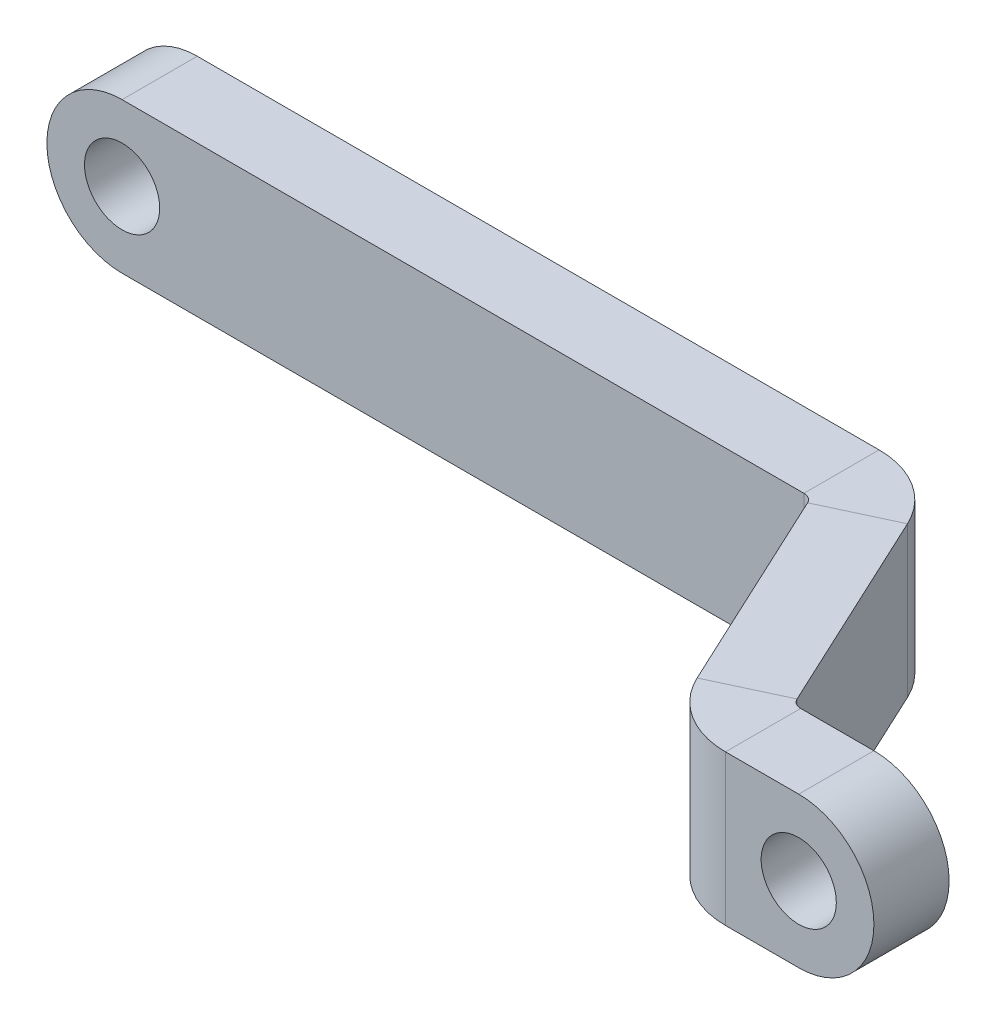
ISO-10303-21;
HEADER;
FILE_DESCRIPTION(('STEP AP214'),'2;1');
FILE_NAME('part.step','',(''),(''),'','','');
FILE_SCHEMA(('AUTOMOTIVE_DESIGN { 1 0 10303 214 1 1 1 1 }'));
ENDSEC;
DATA;
#1=APPLICATION_CONTEXT('core data for automotive mechanical design processes');
#2=APPLICATION_PROTOCOL_DEFINITION('international standard','automotive_design',2000,#1);
#3=PRODUCT_CONTEXT('',#1,'mechanical');
#4=PRODUCT('Part','Part','',(#3));
#5=PRODUCT_RELATED_PRODUCT_CATEGORY('part','',(#4));
#6=PRODUCT_DEFINITION_FORMATION('','',#4);
#7=PRODUCT_DEFINITION_CONTEXT('part definition',#1,'design');
#8=PRODUCT_DEFINITION('design','',#6,#7);
#9=PRODUCT_DEFINITION_SHAPE('','',#8);
#10=(LENGTH_UNIT() NAMED_UNIT(*) SI_UNIT(.MILLI.,.METRE.));
#11=(NAMED_UNIT(*) PLANE_ANGLE_UNIT() SI_UNIT($,.RADIAN.));
#12=(NAMED_UNIT(*) SI_UNIT($,.STERADIAN.) SOLID_ANGLE_UNIT());
#13=UNCERTAINTY_MEASURE_WITH_UNIT(LENGTH_MEASURE(1.E-05),#10,'distance_accuracy_value','');
#14=(GEOMETRIC_REPRESENTATION_CONTEXT(3) GLOBAL_UNCERTAINTY_ASSIGNED_CONTEXT((#13)) GLOBAL_UNIT_ASSIGNED_CONTEXT((#10,
#11,#12)) REPRESENTATION_CONTEXT('',''));
#15=CARTESIAN_POINT('',(0.,0.,0.));
#16=DIRECTION('',(0.,0.,1.));
#17=DIRECTION('',(1.,0.,0.));
#18=AXIS2_PLACEMENT_3D('',#15,#16,#17);
#19=CARTESIAN_POINT('',(29.8289487955123,5.,-46.1124519814672));
#20=DIRECTION('',(0.,1.,0.));
#21=DIRECTION('',(-0.906307787036651,0.,0.422618261740697));
#22=AXIS2_PLACEMENT_3D('',#19,#20,#21);
#23=PLANE('',#22);
#24=DIRECTION('',(-0.422618261740697,0.,-0.906307787036651));
#25=VECTOR('',#24,1.);
#26=CARTESIAN_POINT('',(25.2974098603291,5.,-43.9993606727638));
#27=LINE('',#26,#25);
#28=CARTESIAN_POINT('',(52.4305247207088,5.,14.1877919203017));
#29=VERTEX_POINT('',#28);
#30=CARTESIAN_POINT('',(46.012969057783,5.,0.425299388401803));
#31=VERTEX_POINT('',#30);
#32=EDGE_CURVE('E248',#29,#31,#27,.T.);
#33=ORIENTED_EDGE('',*,*,#32,.F.);
#34=DIRECTION('',(0.906307787036651,0.,-0.422618261740697));
#35=VECTOR('',#34,1.);
#36=CARTESIAN_POINT('',(56.9620636558921,5.,12.0747006115982));
#37=LINE('',#36,#35);
#38=CARTESIAN_POINT('',(56.9620636558921,5.,12.0747006115982));
#39=VERTEX_POINT('',#38);
#40=EDGE_CURVE('E240',#29,#39,#37,.T.);
#41=ORIENTED_EDGE('',*,*,#40,.T.);
#42=DIRECTION('',(-0.422618261740697,0.,-0.906307787036651));
#43=VECTOR('',#42,1.);
#44=CARTESIAN_POINT('',(29.8289487955123,5.,-46.1124519814672));
#45=LINE('',#44,#43);
#46=CARTESIAN_POINT('',(50.5445079929662,5.,-1.68779192030168));
#47=VERTEX_POINT('',#46);
#48=EDGE_CURVE('E47',#39,#47,#45,.T.);
#49=ORIENTED_EDGE('',*,*,#48,.T.);
#50=DIRECTION('',(0.906307787036651,0.,-0.422618261740697));
#51=VECTOR('',#50,1.);
#52=CARTESIAN_POINT('',(50.5445079929662,5.,-1.68779192030168));
#53=LINE('',#52,#51);
#54=EDGE_CURVE('E236',#31,#47,#53,.T.);
#55=ORIENTED_EDGE('',*,*,#54,.F.);
#56=EDGE_LOOP('',(#33,#41,#49,#55));
#57=FACE_BOUND('',#56,.T.);
#58=ADVANCED_FACE('F43',(#57),#23,.T.);
#59=CARTESIAN_POINT('',(29.8289487955123,-5.,-46.1124519814672));
#60=DIRECTION('',(0.,-1.,0.));
#61=DIRECTION('',(0.906307787036651,0.,-0.422618261740697));
#62=AXIS2_PLACEMENT_3D('',#59,#60,#61);
#63=PLANE('',#62);
#64=DIRECTION('',(0.422618261740697,0.,0.906307787036651));
#65=VECTOR('',#64,1.);
#66=CARTESIAN_POINT('',(29.8289487955123,-5.,-46.1124519814672));
#67=LINE('',#66,#65);
#68=CARTESIAN_POINT('',(50.5445079929662,-4.99999999999999,-1.68779192030168));
#69=VERTEX_POINT('',#68);
#70=CARTESIAN_POINT('',(56.9620636558921,-5.,12.0747006115982));
#71=VERTEX_POINT('',#70);
#72=EDGE_CURVE('E245',#69,#71,#67,.T.);
#73=ORIENTED_EDGE('',*,*,#72,.T.);
#74=DIRECTION('',(-0.906307787036651,0.,0.422618261740697));
#75=VECTOR('',#74,1.);
#76=CARTESIAN_POINT('',(56.9620636558921,-5.,12.0747006115982));
#77=LINE('',#76,#75);
#78=CARTESIAN_POINT('',(52.4305247207088,-5.,14.1877919203017));
#79=VERTEX_POINT('',#78);
#80=EDGE_CURVE('E12',#71,#79,#77,.T.);
#81=ORIENTED_EDGE('',*,*,#80,.T.);
#82=DIRECTION('',(0.422618261740697,0.,0.906307787036651));
#83=VECTOR('',#82,1.);
#84=CARTESIAN_POINT('',(25.2974098603291,-5.,-43.9993606727638));
#85=LINE('',#84,#83);
#86=CARTESIAN_POINT('',(46.012969057783,-4.99999999999998,0.425299388401803));
#87=VERTEX_POINT('',#86);
#88=EDGE_CURVE('E194',#87,#79,#85,.T.);
#89=ORIENTED_EDGE('',*,*,#88,.F.);
#90=DIRECTION('',(-0.906307787036651,0.,0.422618261740697));
#91=VECTOR('',#90,1.);
#92=CARTESIAN_POINT('',(50.5445079929662,-5.,-1.68779192030168));
#93=LINE('',#92,#91);
#94=EDGE_CURVE('E232',#69,#87,#93,.T.);
#95=ORIENTED_EDGE('',*,*,#94,.F.);
#96=EDGE_LOOP('',(#73,#81,#89,#95));
#97=FACE_BOUND('',#96,.T.);
#98=ADVANCED_FACE('F45',(#97),#63,.T.);
#99=CARTESIAN_POINT('',(25.2974098603291,0.,-43.9993606727638));
#100=DIRECTION('',(-0.906307787036651,0.,0.422618261740697));
#101=DIRECTION('',(0.422618261740697,0.,0.906307787036651));
#102=AXIS2_PLACEMENT_3D('',#99,#100,#101);
#103=PLANE('',#102);
#104=ORIENTED_EDGE('',*,*,#88,.T.);
#105=DIRECTION('',(0.,1.,0.));
#106=VECTOR('',#105,1.);
#107=CARTESIAN_POINT('',(52.4305247207088,0.,14.1877919203017));
#108=LINE('',#107,#106);
#109=EDGE_CURVE('E52',#79,#29,#108,.T.);
#110=ORIENTED_EDGE('',*,*,#109,.T.);
#111=ORIENTED_EDGE('',*,*,#32,.T.);
#112=DIRECTION('',(0.,1.,0.));
#113=VECTOR('',#112,1.);
#114=CARTESIAN_POINT('',(46.012969057783,0.,0.425299388401801));
#115=LINE('',#114,#113);
#116=EDGE_CURVE('E234',#87,#31,#115,.T.);
#117=ORIENTED_EDGE('',*,*,#116,.F.);
#118=EDGE_LOOP('',(#104,#110,#111,#117));
#119=FACE_BOUND('',#118,.T.);
#120=ADVANCED_FACE('F254',(#119),#103,.T.);
#121=CARTESIAN_POINT('',(29.8289487955123,0.,-46.1124519814672));
#122=DIRECTION('',(-0.906307787036651,0.,0.422618261740697));
#123=DIRECTION('',(0.422618261740697,0.,0.906307787036651));
#124=AXIS2_PLACEMENT_3D('',#121,#122,#123);
#125=PLANE('',#124);
#126=DIRECTION('',(0.,1.,0.));
#127=VECTOR('',#126,1.);
#128=CARTESIAN_POINT('',(56.9620636558921,0.,12.0747006115982));
#129=LINE('',#128,#127);
#130=EDGE_CURVE('E238',#71,#39,#129,.T.);
#131=ORIENTED_EDGE('',*,*,#130,.F.);
#132=ORIENTED_EDGE('',*,*,#72,.F.);
#133=DIRECTION('',(0.,1.,0.));
#134=VECTOR('',#133,1.);
#135=CARTESIAN_POINT('',(50.5445079929662,0.,-1.68779192030168));
#136=LINE('',#135,#134);
#137=EDGE_CURVE('E229',#69,#47,#136,.T.);
#138=ORIENTED_EDGE('',*,*,#137,.T.);
#139=ORIENTED_EDGE('',*,*,#48,.F.);
#140=EDGE_LOOP('',(#131,#132,#138,#139));
#141=FACE_BOUND('',#140,.T.);
#142=ADVANCED_FACE('F267',(#141),#125,.F.);
#143=CARTESIAN_POINT('',(0.,0.,-5.));
#144=DIRECTION('',(0.,0.,1.));
#145=DIRECTION('',(1.,0.,0.));
#146=AXIS2_PLACEMENT_3D('',#143,#144,#145);
#147=CYLINDRICAL_SURFACE('',#146,2.5);
#148=CARTESIAN_POINT('',(0.,0.,-5.));
#149=DIRECTION('',(0.,0.,1.));
#150=DIRECTION('',(1.,0.,0.));
#151=AXIS2_PLACEMENT_3D('',#148,#149,#150);
#152=CIRCLE('',#151,2.5);
#153=CARTESIAN_POINT('',(2.5,0.,-5.));
#154=VERTEX_POINT('',#153);
#155=EDGE_CURVE('E217',#154,#154,#152,.T.);
#156=ORIENTED_EDGE('',*,*,#155,.F.);
#157=EDGE_LOOP('',(#156));
#158=FACE_BOUND('',#157,.T.);
#159=CARTESIAN_POINT('',(0.,0.,0.));
#160=DIRECTION('',(0.,0.,1.));
#161=DIRECTION('',(1.,0.,0.));
#162=AXIS2_PLACEMENT_3D('',#159,#160,#161);
#163=CIRCLE('',#162,2.5);
#164=CARTESIAN_POINT('',(2.5,0.,0.));
#165=VERTEX_POINT('',#164);
#166=EDGE_CURVE('E225',#165,#165,#163,.T.);
#167=ORIENTED_EDGE('',*,*,#166,.T.);
#168=EDGE_LOOP('',(#167));
#169=FACE_BOUND('',#168,.T.);
#170=ADVANCED_FACE('F316',(#158,#169),#147,.F.);
#171=CARTESIAN_POINT('',(0.,0.,-5.));
#172=DIRECTION('',(0.,0.,1.));
#173=DIRECTION('',(1.,0.,0.));
#174=AXIS2_PLACEMENT_3D('',#171,#172,#173);
#175=CYLINDRICAL_SURFACE('',#174,5.);
#176=CARTESIAN_POINT('',(0.,0.,0.));
#177=DIRECTION('',(0.,0.,1.));
#178=DIRECTION('',(1.,0.,0.));
#179=AXIS2_PLACEMENT_3D('',#176,#177,#178);
#180=CIRCLE('',#179,5.);
#181=CARTESIAN_POINT('',(0.,5.,0.));
#182=VERTEX_POINT('',#181);
#183=CARTESIAN_POINT('',(0.,-5.,0.));
#184=VERTEX_POINT('',#183);
#185=EDGE_CURVE('E200',#182,#184,#180,.T.);
#186=ORIENTED_EDGE('',*,*,#185,.F.);
#187=DIRECTION('',(0.,0.,1.));
#188=VECTOR('',#187,1.);
#189=CARTESIAN_POINT('',(0.,5.,-5.));
#190=LINE('',#189,#188);
#191=CARTESIAN_POINT('',(0.,5.,-5.));
#192=VERTEX_POINT('',#191);
#193=EDGE_CURVE('E191',#192,#182,#190,.T.);
#194=ORIENTED_EDGE('',*,*,#193,.F.);
#195=CARTESIAN_POINT('',(0.,0.,-5.));
#196=DIRECTION('',(0.,0.,1.));
#197=DIRECTION('',(1.,0.,0.));
#198=AXIS2_PLACEMENT_3D('',#195,#196,#197);
#199=CIRCLE('',#198,5.);
#200=CARTESIAN_POINT('',(0.,-5.,-5.));
#201=VERTEX_POINT('',#200);
#202=EDGE_CURVE('E222',#192,#201,#199,.T.);
#203=ORIENTED_EDGE('',*,*,#202,.T.);
#204=DIRECTION('',(0.,0.,1.));
#205=VECTOR('',#204,1.);
#206=CARTESIAN_POINT('',(0.,-5.,-5.));
#207=LINE('',#206,#205);
#208=EDGE_CURVE('E220',#201,#184,#207,.T.);
#209=ORIENTED_EDGE('',*,*,#208,.T.);
#210=EDGE_LOOP('',(#186,#194,#203,#209));
#211=FACE_BOUND('',#210,.T.);
#212=ADVANCED_FACE('F320',(#211),#175,.T.);
#213=CARTESIAN_POINT('',(0.,0.,-5.));
#214=DIRECTION('',(0.,0.,1.));
#215=DIRECTION('',(1.,0.,0.));
#216=AXIS2_PLACEMENT_3D('',#213,#214,#215);
#217=PLANE('',#216);
#218=DIRECTION('',(0.,1.,0.));
#219=VECTOR('',#218,1.);
#220=CARTESIAN_POINT('',(45.3453827418518,0.,-5.));
#221=LINE('',#220,#219);
#222=CARTESIAN_POINT('',(45.3453827418518,-4.99999999999999,-5.));
#223=VERTEX_POINT('',#222);
#224=CARTESIAN_POINT('',(45.3453827418518,5.,-5.));
#225=VERTEX_POINT('',#224);
#226=EDGE_CURVE('E187',#223,#225,#221,.T.);
#227=ORIENTED_EDGE('',*,*,#226,.F.);
#228=DIRECTION('',(1.,0.,0.));
#229=VECTOR('',#228,1.);
#230=CARTESIAN_POINT('',(0.,-5.,-5.));
#231=LINE('',#230,#229);
#232=EDGE_CURVE('E214',#201,#223,#231,.T.);
#233=ORIENTED_EDGE('',*,*,#232,.F.);
#234=ORIENTED_EDGE('',*,*,#202,.F.);
#235=DIRECTION('',(-1.,0.,0.));
#236=VECTOR('',#235,1.);
#237=CARTESIAN_POINT('',(0.,5.,-5.));
#238=LINE('',#237,#236);
#239=EDGE_CURVE('E195',#225,#192,#238,.T.);
#240=ORIENTED_EDGE('',*,*,#239,.F.);
#241=EDGE_LOOP('',(#227,#233,#234,#240));
#242=FACE_BOUND('',#241,.T.);
#243=ORIENTED_EDGE('',*,*,#155,.T.);
#244=EDGE_LOOP('',(#243));
#245=FACE_BOUND('',#244,.T.);
#246=ADVANCED_FACE('F326',(#242,#245),#217,.F.);
#247=CARTESIAN_POINT('',(0.,-5.,-5.));
#248=DIRECTION('',(0.,-1.,0.));
#249=DIRECTION('',(0.,0.,-1.));
#250=AXIS2_PLACEMENT_3D('',#247,#248,#249);
#251=PLANE('',#250);
#252=ORIENTED_EDGE('',*,*,#232,.T.);
#253=DIRECTION('',(0.,0.,1.));
#254=VECTOR('',#253,1.);
#255=CARTESIAN_POINT('',(45.3453827418518,-5.,-5.));
#256=LINE('',#255,#254);
#257=CARTESIAN_POINT('',(45.3453827418518,-5.,0.));
#258=VERTEX_POINT('',#257);
#259=EDGE_CURVE('E211',#223,#258,#256,.T.);
#260=ORIENTED_EDGE('',*,*,#259,.T.);
#261=DIRECTION('',(1.,0.,0.));
#262=VECTOR('',#261,1.);
#263=CARTESIAN_POINT('',(0.,-5.,0.));
#264=LINE('',#263,#262);
#265=EDGE_CURVE('E208',#184,#258,#264,.T.);
#266=ORIENTED_EDGE('',*,*,#265,.F.);
#267=ORIENTED_EDGE('',*,*,#208,.F.);
#268=EDGE_LOOP('',(#252,#260,#266,#267));
#269=FACE_BOUND('',#268,.T.);
#270=ADVANCED_FACE('F337',(#269),#251,.T.);
#271=CARTESIAN_POINT('',(0.,0.,0.));
#272=DIRECTION('',(0.,0.,1.));
#273=DIRECTION('',(1.,0.,0.));
#274=AXIS2_PLACEMENT_3D('',#271,#272,#273);
#275=PLANE('',#274);
#276=ORIENTED_EDGE('',*,*,#166,.F.);
#277=EDGE_LOOP('',(#276));
#278=FACE_BOUND('',#277,.T.);
#279=ORIENTED_EDGE('',*,*,#265,.T.);
#280=DIRECTION('',(0.,1.,0.));
#281=VECTOR('',#280,1.);
#282=CARTESIAN_POINT('',(45.3453827418518,0.,0.));
#283=LINE('',#282,#281);
#284=CARTESIAN_POINT('',(45.3453827418518,5.,0.));
#285=VERTEX_POINT('',#284);
#286=EDGE_CURVE('E205',#258,#285,#283,.T.);
#287=ORIENTED_EDGE('',*,*,#286,.T.);
#288=DIRECTION('',(-1.,0.,0.));
#289=VECTOR('',#288,1.);
#290=CARTESIAN_POINT('',(0.,5.,0.));
#291=LINE('',#290,#289);
#292=EDGE_CURVE('E203',#285,#182,#291,.T.);
#293=ORIENTED_EDGE('',*,*,#292,.T.);
#294=ORIENTED_EDGE('',*,*,#185,.T.);
#295=EDGE_LOOP('',(#279,#287,#293,#294));
#296=FACE_BOUND('',#295,.T.);
#297=ADVANCED_FACE('F341',(#278,#296),#275,.T.);
#298=CARTESIAN_POINT('',(0.,5.,-5.));
#299=DIRECTION('',(0.,1.,0.));
#300=DIRECTION('',(0.,0.,1.));
#301=AXIS2_PLACEMENT_3D('',#298,#299,#300);
#302=PLANE('',#301);
#303=ORIENTED_EDGE('',*,*,#292,.F.);
#304=DIRECTION('',(0.,0.,-1.));
#305=VECTOR('',#304,1.);
#306=CARTESIAN_POINT('',(45.3453827418518,5.,-5.));
#307=LINE('',#306,#305);
#308=EDGE_CURVE('E197',#285,#225,#307,.T.);
#309=ORIENTED_EDGE('',*,*,#308,.T.);
#310=ORIENTED_EDGE('',*,*,#239,.T.);
#311=ORIENTED_EDGE('',*,*,#193,.T.);
#312=EDGE_LOOP('',(#303,#309,#310,#311));
#313=FACE_BOUND('',#312,.T.);
#314=ADVANCED_FACE('F344',(#313),#302,.T.);
#315=CARTESIAN_POINT('',(45.3453827418518,-4.99999999999999,0.7366));
#316=DIRECTION('',(0.,-1.,0.));
#317=DIRECTION('',(0.,0.,-1.));
#318=AXIS2_PLACEMENT_3D('',#315,#316,#317);
#319=PLANE('',#318);
#320=ORIENTED_EDGE('',*,*,#94,.T.);
#321=CARTESIAN_POINT('',(45.3453827418518,-4.99999999999999,0.7366));
#322=DIRECTION('',(0.,-1.,0.));
#323=DIRECTION('',(0.,0.,-1.));
#324=AXIS2_PLACEMENT_3D('',#321,#322,#323);
#325=CIRCLE('',#324,0.7366);
#326=EDGE_CURVE('E178',#87,#258,#325,.F.);
#327=ORIENTED_EDGE('',*,*,#326,.T.);
#328=ORIENTED_EDGE('',*,*,#259,.F.);
#329=CARTESIAN_POINT('',(45.3453827418518,-4.99999999999999,0.7366));
#330=DIRECTION('',(0.,1.,0.));
#331=DIRECTION('',(0.,0.,-1.));
#332=AXIS2_PLACEMENT_3D('',#329,#330,#331);
#333=CIRCLE('',#332,5.7366);
#334=EDGE_CURVE('E182',#69,#223,#333,.T.);
#335=ORIENTED_EDGE('',*,*,#334,.F.);
#336=EDGE_LOOP('',(#320,#327,#328,#335));
#337=FACE_BOUND('',#336,.T.);
#338=ADVANCED_FACE('F347',(#337),#319,.T.);
#339=CARTESIAN_POINT('',(45.3453827418518,5.,0.7366));
#340=DIRECTION('',(0.,1.,0.));
#341=DIRECTION('',(0.,0.,1.));
#342=AXIS2_PLACEMENT_3D('',#339,#340,#341);
#343=PLANE('',#342);
#344=CARTESIAN_POINT('',(45.3453827418518,5.,0.7366));
#345=DIRECTION('',(0.,-1.,0.));
#346=DIRECTION('',(0.,0.,-1.));
#347=AXIS2_PLACEMENT_3D('',#344,#345,#346);
#348=CIRCLE('',#347,0.7366);
#349=EDGE_CURVE('E185',#285,#31,#348,.T.);
#350=ORIENTED_EDGE('',*,*,#349,.T.);
#351=ORIENTED_EDGE('',*,*,#54,.T.);
#352=CARTESIAN_POINT('',(45.3453827418518,5.,0.7366));
#353=DIRECTION('',(0.,-1.,0.));
#354=DIRECTION('',(0.,0.,1.));
#355=AXIS2_PLACEMENT_3D('',#352,#353,#354);
#356=CIRCLE('',#355,5.7366);
#357=EDGE_CURVE('E68',#225,#47,#356,.T.);
#358=ORIENTED_EDGE('',*,*,#357,.F.);
#359=ORIENTED_EDGE('',*,*,#308,.F.);
#360=EDGE_LOOP('',(#350,#351,#358,#359));
#361=FACE_BOUND('',#360,.T.);
#362=ADVANCED_FACE('F332',(#361),#343,.T.);
#363=CARTESIAN_POINT('',(45.3453827418518,11.7678443637323,0.7366));
#364=DIRECTION('',(0.,-1.,0.));
#365=DIRECTION('',(0.,0.,-1.));
#366=AXIS2_PLACEMENT_3D('',#363,#364,#365);
#367=CYLINDRICAL_SURFACE('',#366,5.7366);
#368=ORIENTED_EDGE('',*,*,#226,.T.);
#369=ORIENTED_EDGE('',*,*,#357,.T.);
#370=ORIENTED_EDGE('',*,*,#137,.F.);
#371=ORIENTED_EDGE('',*,*,#334,.T.);
#372=EDGE_LOOP('',(#368,#369,#370,#371));
#373=FACE_BOUND('',#372,.T.);
#374=ADVANCED_FACE('F370',(#373),#367,.T.);
#375=CARTESIAN_POINT('',(45.3453827418518,11.7678443637323,0.7366));
#376=DIRECTION('',(0.,-1.,0.));
#377=DIRECTION('',(0.,0.,-1.));
#378=AXIS2_PLACEMENT_3D('',#375,#376,#377);
#379=CYLINDRICAL_SURFACE('',#378,0.7366);
#380=ORIENTED_EDGE('',*,*,#286,.F.);
#381=ORIENTED_EDGE('',*,*,#326,.F.);
#382=ORIENTED_EDGE('',*,*,#116,.T.);
#383=ORIENTED_EDGE('',*,*,#349,.F.);
#384=EDGE_LOOP('',(#380,#381,#382,#383));
#385=FACE_BOUND('',#384,.T.);
#386=ADVANCED_FACE('F362',(#385),#379,.F.);
#387=CARTESIAN_POINT('',(57.6296499718233,-5.,11.7634));
#388=DIRECTION('',(0.,1.,0.));
#389=DIRECTION('',(0.,0.,1.));
#390=AXIS2_PLACEMENT_3D('',#387,#388,#389);
#391=PLANE('',#390);
#392=DIRECTION('',(0.,0.,1.));
#393=VECTOR('',#392,1.);
#394=CARTESIAN_POINT('',(57.6296499718233,-5.,12.5));
#395=LINE('',#394,#393);
#396=CARTESIAN_POINT('',(57.6296499718233,-5.,12.5));
#397=VERTEX_POINT('',#396);
#398=CARTESIAN_POINT('',(57.6296499718233,-5.,17.5));
#399=VERTEX_POINT('',#398);
#400=EDGE_CURVE('E140',#397,#399,#395,.T.);
#401=ORIENTED_EDGE('',*,*,#400,.T.);
#402=CARTESIAN_POINT('',(57.6296499718233,-5.,11.7634));
#403=DIRECTION('',(0.,-1.,0.));
#404=DIRECTION('',(0.,0.,-1.));
#405=AXIS2_PLACEMENT_3D('',#402,#403,#404);
#406=CIRCLE('',#405,5.7366);
#407=EDGE_CURVE('E60',#399,#79,#406,.T.);
#408=ORIENTED_EDGE('',*,*,#407,.T.);
#409=ORIENTED_EDGE('',*,*,#80,.F.);
#410=CARTESIAN_POINT('',(57.6296499718233,-5.,11.7634));
#411=DIRECTION('',(0.,-1.,0.));
#412=DIRECTION('',(0.,0.,1.));
#413=AXIS2_PLACEMENT_3D('',#410,#411,#412);
#414=CIRCLE('',#413,0.7366);
#415=EDGE_CURVE('E171',#397,#71,#414,.T.);
#416=ORIENTED_EDGE('',*,*,#415,.F.);
#417=EDGE_LOOP('',(#401,#408,#409,#416));
#418=FACE_BOUND('',#417,.T.);
#419=ADVANCED_FACE('F259',(#418),#391,.F.);
#420=CARTESIAN_POINT('',(57.6296499718233,5.,11.7634));
#421=DIRECTION('',(0.,-1.,0.));
#422=DIRECTION('',(0.,0.,-1.));
#423=AXIS2_PLACEMENT_3D('',#420,#421,#422);
#424=PLANE('',#423);
#425=CARTESIAN_POINT('',(57.6296499718233,5.,11.7634));
#426=DIRECTION('',(0.,-1.,0.));
#427=DIRECTION('',(0.,0.,-1.));
#428=AXIS2_PLACEMENT_3D('',#425,#426,#427);
#429=CIRCLE('',#428,5.7366);
#430=CARTESIAN_POINT('',(57.6296499718233,5.,17.5));
#431=VERTEX_POINT('',#430);
#432=EDGE_CURVE('E175',#29,#431,#429,.F.);
#433=ORIENTED_EDGE('',*,*,#432,.T.);
#434=DIRECTION('',(0.,0.,-1.));
#435=VECTOR('',#434,1.);
#436=CARTESIAN_POINT('',(57.6296499718233,5.,12.5));
#437=LINE('',#436,#435);
#438=CARTESIAN_POINT('',(57.6296499718233,5.,12.5));
#439=VERTEX_POINT('',#438);
#440=EDGE_CURVE('E159',#431,#439,#437,.T.);
#441=ORIENTED_EDGE('',*,*,#440,.T.);
#442=CARTESIAN_POINT('',(57.6296499718233,5.,11.7634));
#443=DIRECTION('',(0.,1.,0.));
#444=DIRECTION('',(0.,0.,-1.));
#445=AXIS2_PLACEMENT_3D('',#442,#443,#444);
#446=CIRCLE('',#445,0.7366);
#447=EDGE_CURVE('E174',#39,#439,#446,.T.);
#448=ORIENTED_EDGE('',*,*,#447,.F.);
#449=ORIENTED_EDGE('',*,*,#40,.F.);
#450=EDGE_LOOP('',(#433,#441,#448,#449));
#451=FACE_BOUND('',#450,.T.);
#452=ADVANCED_FACE('F274',(#451),#424,.F.);
#453=CARTESIAN_POINT('',(57.6296499718233,12.9077429682134,11.7634));
#454=DIRECTION('',(0.,-1.,0.));
#455=DIRECTION('',(0.,0.,-1.));
#456=AXIS2_PLACEMENT_3D('',#453,#454,#455);
#457=CYLINDRICAL_SURFACE('',#456,0.7366);
#458=ORIENTED_EDGE('',*,*,#130,.T.);
#459=ORIENTED_EDGE('',*,*,#447,.T.);
#460=DIRECTION('',(0.,1.,0.));
#461=VECTOR('',#460,1.);
#462=CARTESIAN_POINT('',(57.6296499718233,0.,12.5));
#463=LINE('',#462,#461);
#464=EDGE_CURVE('E264',#397,#439,#463,.T.);
#465=ORIENTED_EDGE('',*,*,#464,.F.);
#466=ORIENTED_EDGE('',*,*,#415,.T.);
#467=EDGE_LOOP('',(#458,#459,#465,#466));
#468=FACE_BOUND('',#467,.T.);
#469=ADVANCED_FACE('F262',(#468),#457,.F.);
#470=CARTESIAN_POINT('',(57.6296499718233,12.9077429682134,11.7634));
#471=DIRECTION('',(0.,-1.,0.));
#472=DIRECTION('',(0.,0.,-1.));
#473=AXIS2_PLACEMENT_3D('',#470,#471,#472);
#474=CYLINDRICAL_SURFACE('',#473,5.7366);
#475=ORIENTED_EDGE('',*,*,#109,.F.);
#476=ORIENTED_EDGE('',*,*,#407,.F.);
#477=DIRECTION('',(0.,1.,0.));
#478=VECTOR('',#477,1.);
#479=CARTESIAN_POINT('',(57.6296499718233,0.,17.5));
#480=LINE('',#479,#478);
#481=EDGE_CURVE('E164',#399,#431,#480,.T.);
#482=ORIENTED_EDGE('',*,*,#481,.T.);
#483=ORIENTED_EDGE('',*,*,#432,.F.);
#484=EDGE_LOOP('',(#475,#476,#482,#483));
#485=FACE_BOUND('',#484,.T.);
#486=ADVANCED_FACE('F276',(#485),#474,.T.);
#487=CARTESIAN_POINT('',(62.5,0.,12.5));
#488=DIRECTION('',(0.,0.,1.));
#489=DIRECTION('',(1.,0.,0.));
#490=AXIS2_PLACEMENT_3D('',#487,#488,#489);
#491=CYLINDRICAL_SURFACE('',#490,5.);
#492=CARTESIAN_POINT('',(62.5,0.,17.5));
#493=DIRECTION('',(0.,0.,1.));
#494=DIRECTION('',(1.,0.,0.));
#495=AXIS2_PLACEMENT_3D('',#492,#493,#494);
#496=CIRCLE('',#495,5.);
#497=CARTESIAN_POINT('',(62.5,-5.,17.5));
#498=VERTEX_POINT('',#497);
#499=CARTESIAN_POINT('',(62.5,5.,17.5));
#500=VERTEX_POINT('',#499);
#501=EDGE_CURVE('E152',#498,#500,#496,.T.);
#502=ORIENTED_EDGE('',*,*,#501,.F.);
#503=DIRECTION('',(0.,0.,1.));
#504=VECTOR('',#503,1.);
#505=CARTESIAN_POINT('',(62.5,-5.,12.5));
#506=LINE('',#505,#504);
#507=CARTESIAN_POINT('',(62.5,-5.,12.5));
#508=VERTEX_POINT('',#507);
#509=EDGE_CURVE('E138',#508,#498,#506,.T.);
#510=ORIENTED_EDGE('',*,*,#509,.F.);
#511=CARTESIAN_POINT('',(62.5,0.,12.5));
#512=DIRECTION('',(0.,0.,1.));
#513=DIRECTION('',(1.,0.,0.));
#514=AXIS2_PLACEMENT_3D('',#511,#512,#513);
#515=CIRCLE('',#514,5.);
#516=CARTESIAN_POINT('',(62.5,5.,12.5));
#517=VERTEX_POINT('',#516);
#518=EDGE_CURVE('E150',#508,#517,#515,.T.);
#519=ORIENTED_EDGE('',*,*,#518,.T.);
#520=DIRECTION('',(0.,0.,1.));
#521=VECTOR('',#520,1.);
#522=CARTESIAN_POINT('',(62.5,5.,12.5));
#523=LINE('',#522,#521);
#524=EDGE_CURVE('E158',#517,#500,#523,.T.);
#525=ORIENTED_EDGE('',*,*,#524,.T.);
#526=EDGE_LOOP('',(#502,#510,#519,#525));
#527=FACE_BOUND('',#526,.T.);
#528=ADVANCED_FACE('F148',(#527),#491,.T.);
#529=CARTESIAN_POINT('',(62.5,0.,12.5));
#530=DIRECTION('',(0.,0.,1.));
#531=DIRECTION('',(1.,0.,0.));
#532=AXIS2_PLACEMENT_3D('',#529,#530,#531);
#533=CYLINDRICAL_SURFACE('',#532,2.49999999999999);
#534=CARTESIAN_POINT('',(62.5,0.,12.5));
#535=DIRECTION('',(0.,0.,1.));
#536=DIRECTION('',(1.,0.,0.));
#537=AXIS2_PLACEMENT_3D('',#534,#535,#536);
#538=CIRCLE('',#537,2.49999999999999);
#539=CARTESIAN_POINT('',(65.,0.,12.5));
#540=VERTEX_POINT('',#539);
#541=EDGE_CURVE('E288',#540,#540,#538,.T.);
#542=ORIENTED_EDGE('',*,*,#541,.F.);
#543=EDGE_LOOP('',(#542));
#544=FACE_BOUND('',#543,.T.);
#545=CARTESIAN_POINT('',(62.5,0.,17.5));
#546=DIRECTION('',(0.,0.,1.));
#547=DIRECTION('',(1.,0.,0.));
#548=AXIS2_PLACEMENT_3D('',#545,#546,#547);
#549=CIRCLE('',#548,2.49999999999999);
#550=CARTESIAN_POINT('',(65.,0.,17.5));
#551=VERTEX_POINT('',#550);
#552=EDGE_CURVE('E161',#551,#551,#549,.T.);
#553=ORIENTED_EDGE('',*,*,#552,.T.);
#554=EDGE_LOOP('',(#553));
#555=FACE_BOUND('',#554,.T.);
#556=ADVANCED_FACE('F296',(#544,#555),#533,.F.);
#557=CARTESIAN_POINT('',(-10.2445755937193,0.,12.5));
#558=DIRECTION('',(0.,0.,1.));
#559=DIRECTION('',(1.,0.,0.));
#560=AXIS2_PLACEMENT_3D('',#557,#558,#559);
#561=PLANE('',#560);
#562=ORIENTED_EDGE('',*,*,#541,.T.);
#563=EDGE_LOOP('',(#562));
#564=FACE_BOUND('',#563,.T.);
#565=DIRECTION('',(1.,0.,0.));
#566=VECTOR('',#565,1.);
#567=CARTESIAN_POINT('',(-10.2445755937193,-5.,12.5));
#568=LINE('',#567,#566);
#569=EDGE_CURVE('E135',#397,#508,#568,.T.);
#570=ORIENTED_EDGE('',*,*,#569,.F.);
#571=ORIENTED_EDGE('',*,*,#464,.T.);
#572=DIRECTION('',(-1.,0.,0.));
#573=VECTOR('',#572,1.);
#574=CARTESIAN_POINT('',(-10.2445755937193,5.,12.5));
#575=LINE('',#574,#573);
#576=EDGE_CURVE('E156',#517,#439,#575,.T.);
#577=ORIENTED_EDGE('',*,*,#576,.F.);
#578=ORIENTED_EDGE('',*,*,#518,.F.);
#579=EDGE_LOOP('',(#570,#571,#577,#578));
#580=FACE_BOUND('',#579,.T.);
#581=ADVANCED_FACE('F154',(#564,#580),#561,.F.);
#582=CARTESIAN_POINT('',(-10.2445755937193,5.,12.5));
#583=DIRECTION('',(0.,1.,0.));
#584=DIRECTION('',(0.,0.,1.));
#585=AXIS2_PLACEMENT_3D('',#582,#583,#584);
#586=PLANE('',#585);
#587=ORIENTED_EDGE('',*,*,#440,.F.);
#588=DIRECTION('',(-1.,0.,0.));
#589=VECTOR('',#588,1.);
#590=CARTESIAN_POINT('',(-10.2445755937193,5.,17.5));
#591=LINE('',#590,#589);
#592=EDGE_CURVE('E144',#500,#431,#591,.T.);
#593=ORIENTED_EDGE('',*,*,#592,.F.);
#594=ORIENTED_EDGE('',*,*,#524,.F.);
#595=ORIENTED_EDGE('',*,*,#576,.T.);
#596=EDGE_LOOP('',(#587,#593,#594,#595));
#597=FACE_BOUND('',#596,.T.);
#598=ADVANCED_FACE('F285',(#597),#586,.T.);
#599=CARTESIAN_POINT('',(-10.2445755937193,0.,17.5));
#600=DIRECTION('',(0.,0.,1.));
#601=DIRECTION('',(1.,0.,0.));
#602=AXIS2_PLACEMENT_3D('',#599,#600,#601);
#603=PLANE('',#602);
#604=ORIENTED_EDGE('',*,*,#481,.F.);
#605=DIRECTION('',(1.,0.,0.));
#606=VECTOR('',#605,1.);
#607=CARTESIAN_POINT('',(-10.2445755937193,-5.,17.5));
#608=LINE('',#607,#606);
#609=EDGE_CURVE('E281',#399,#498,#608,.T.);
#610=ORIENTED_EDGE('',*,*,#609,.T.);
#611=ORIENTED_EDGE('',*,*,#501,.T.);
#612=ORIENTED_EDGE('',*,*,#592,.T.);
#613=EDGE_LOOP('',(#604,#610,#611,#612));
#614=FACE_BOUND('',#613,.T.);
#615=ORIENTED_EDGE('',*,*,#552,.F.);
#616=EDGE_LOOP('',(#615));
#617=FACE_BOUND('',#616,.T.);
#618=ADVANCED_FACE('F279',(#614,#617),#603,.T.);
#619=CARTESIAN_POINT('',(-10.2445755937193,-5.,12.5));
#620=DIRECTION('',(0.,-1.,0.));
#621=DIRECTION('',(0.,0.,-1.));
#622=AXIS2_PLACEMENT_3D('',#619,#620,#621);
#623=PLANE('',#622);
#624=ORIENTED_EDGE('',*,*,#400,.F.);
#625=ORIENTED_EDGE('',*,*,#569,.T.);
#626=ORIENTED_EDGE('',*,*,#509,.T.);
#627=ORIENTED_EDGE('',*,*,#609,.F.);
#628=EDGE_LOOP('',(#624,#625,#626,#627));
#629=FACE_BOUND('',#628,.T.);
#630=ADVANCED_FACE('F137',(#629),#623,.T.);
#631=CLOSED_SHELL('',(#58,#98,#120,#142,#170,#212,#246,#270,#297,#314,#338,#362,#374,#386,#419,
#452,#469,#486,#528,#556,#581,#598,#618,#630));
#632=MANIFOLD_SOLID_BREP('B2',#631);
#633=ADVANCED_BREP_SHAPE_REPRESENTATION('',(#18,#632),#14);
#634=SHAPE_DEFINITION_REPRESENTATION(#9,#633);
ENDSEC;
END-ISO-10303-21;
